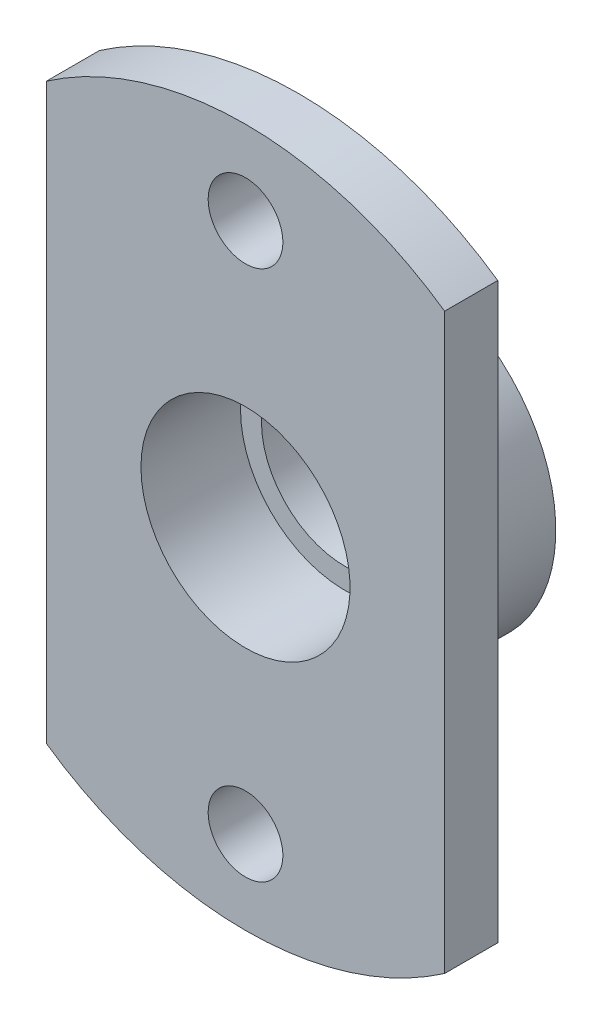
ISO-10303-21;
HEADER;
FILE_DESCRIPTION(('STEP AP214'),'2;1');
FILE_NAME('part.step','',(''),(''),'','','');
FILE_SCHEMA(('AUTOMOTIVE_DESIGN { 1 0 10303 214 1 1 1 1 }'));
ENDSEC;
DATA;
#1=APPLICATION_CONTEXT('core data for automotive mechanical design processes');
#2=APPLICATION_PROTOCOL_DEFINITION('international standard','automotive_design',2000,#1);
#3=PRODUCT_CONTEXT('',#1,'mechanical');
#4=PRODUCT('Part','Part','',(#3));
#5=PRODUCT_RELATED_PRODUCT_CATEGORY('part','',(#4));
#6=PRODUCT_DEFINITION_FORMATION('','',#4);
#7=PRODUCT_DEFINITION_CONTEXT('part definition',#1,'design');
#8=PRODUCT_DEFINITION('design','',#6,#7);
#9=PRODUCT_DEFINITION_SHAPE('','',#8);
#10=(LENGTH_UNIT() NAMED_UNIT(*) SI_UNIT(.MILLI.,.METRE.));
#11=(NAMED_UNIT(*) PLANE_ANGLE_UNIT() SI_UNIT($,.RADIAN.));
#12=(NAMED_UNIT(*) SI_UNIT($,.STERADIAN.) SOLID_ANGLE_UNIT());
#13=UNCERTAINTY_MEASURE_WITH_UNIT(LENGTH_MEASURE(1.E-05),#10,'distance_accuracy_value','');
#14=(GEOMETRIC_REPRESENTATION_CONTEXT(3) GLOBAL_UNCERTAINTY_ASSIGNED_CONTEXT((#13)) GLOBAL_UNIT_ASSIGNED_CONTEXT((#10,
#11,#12)) REPRESENTATION_CONTEXT('',''));
#15=CARTESIAN_POINT('',(0.,0.,0.));
#16=DIRECTION('',(0.,0.,1.));
#17=DIRECTION('',(1.,0.,0.));
#18=AXIS2_PLACEMENT_3D('',#15,#16,#17);
#19=CARTESIAN_POINT('',(-16.7,0.,-8.74451798495317));
#20=DIRECTION('',(0.,0.,-1.));
#21=DIRECTION('',(-1.,0.,0.));
#22=AXIS2_PLACEMENT_3D('',#19,#20,#21);
#23=CYLINDRICAL_SURFACE('',#22,16.7);
#24=CARTESIAN_POINT('',(-16.7,0.,0.));
#25=DIRECTION('',(0.,0.,-1.));
#26=DIRECTION('',(-1.,0.,0.));
#27=AXIS2_PLACEMENT_3D('',#24,#25,#26);
#28=CIRCLE('',#27,16.7);
#29=CARTESIAN_POINT('',(-7.175,-13.7173020306473,0.));
#30=VERTEX_POINT('',#29);
#31=CARTESIAN_POINT('',(-26.225,-13.7173020306473,0.));
#32=VERTEX_POINT('',#31);
#33=EDGE_CURVE('E89',#30,#32,#28,.T.);
#34=ORIENTED_EDGE('',*,*,#33,.T.);
#35=DIRECTION('',(0.,0.,-1.));
#36=VECTOR('',#35,1.);
#37=CARTESIAN_POINT('',(-26.225,-13.7173020306473,-8.74451798495316));
#38=LINE('',#37,#36);
#39=CARTESIAN_POINT('',(-26.225,-13.7173020306473,-2.53999999999999));
#40=VERTEX_POINT('',#39);
#41=EDGE_CURVE('E104',#32,#40,#38,.T.);
#42=ORIENTED_EDGE('',*,*,#41,.T.);
#43=CARTESIAN_POINT('',(-16.7,0.,-2.54));
#44=DIRECTION('',(0.,0.,-1.));
#45=DIRECTION('',(-1.,0.,0.));
#46=AXIS2_PLACEMENT_3D('',#43,#44,#45);
#47=CIRCLE('',#46,16.7);
#48=CARTESIAN_POINT('',(-7.175,-13.7173020306473,-2.54));
#49=VERTEX_POINT('',#48);
#50=EDGE_CURVE('E107',#49,#40,#47,.T.);
#51=ORIENTED_EDGE('',*,*,#50,.F.);
#52=DIRECTION('',(0.,0.,-1.));
#53=VECTOR('',#52,1.);
#54=CARTESIAN_POINT('',(-7.175,-13.7173020306473,-8.74451798495317));
#55=LINE('',#54,#53);
#56=EDGE_CURVE('E48',#49,#30,#55,.F.);
#57=ORIENTED_EDGE('',*,*,#56,.T.);
#58=EDGE_LOOP('',(#34,#42,#51,#57));
#59=FACE_BOUND('',#58,.T.);
#60=ADVANCED_FACE('F33',(#59),#23,.T.);
#61=CARTESIAN_POINT('',(-26.225,13.7173020306473,-2.53999999999999));
#62=VERTEX_POINT('',#61);
#63=CARTESIAN_POINT('',(-7.175,13.7173020306473,-2.54));
#64=VERTEX_POINT('',#63);
#65=EDGE_CURVE('E111',#62,#64,#47,.T.);
#66=ORIENTED_EDGE('',*,*,#65,.F.);
#67=DIRECTION('',(0.,0.,-1.));
#68=VECTOR('',#67,1.);
#69=CARTESIAN_POINT('',(-26.225,13.7173020306473,-8.74451798495316));
#70=LINE('',#69,#68);
#71=CARTESIAN_POINT('',(-26.225,13.7173020306473,0.));
#72=VERTEX_POINT('',#71);
#73=EDGE_CURVE('E56',#62,#72,#70,.F.);
#74=ORIENTED_EDGE('',*,*,#73,.T.);
#75=CARTESIAN_POINT('',(-7.175,13.7173020306473,0.));
#76=VERTEX_POINT('',#75);
#77=EDGE_CURVE('E87',#72,#76,#28,.T.);
#78=ORIENTED_EDGE('',*,*,#77,.T.);
#79=DIRECTION('',(0.,0.,-1.));
#80=VECTOR('',#79,1.);
#81=CARTESIAN_POINT('',(-7.175,13.7173020306473,-8.74451798495317));
#82=LINE('',#81,#80);
#83=EDGE_CURVE('E71',#76,#64,#82,.T.);
#84=ORIENTED_EDGE('',*,*,#83,.T.);
#85=EDGE_LOOP('',(#66,#74,#78,#84));
#86=FACE_BOUND('',#85,.T.);
#87=ADVANCED_FACE('F35',(#86),#23,.T.);
#88=CARTESIAN_POINT('',(0.,0.,0.));
#89=DIRECTION('',(0.,0.,-1.));
#90=DIRECTION('',(-1.,0.,0.));
#91=AXIS2_PLACEMENT_3D('',#88,#89,#90);
#92=PLANE('',#91);
#93=CARTESIAN_POINT('',(-16.7,12.7,0.));
#94=DIRECTION('',(0.,0.,-1.));
#95=DIRECTION('',(-1.,0.,0.));
#96=AXIS2_PLACEMENT_3D('',#93,#94,#95);
#97=CIRCLE('',#96,1.7859375);
#98=CARTESIAN_POINT('',(-18.4859375,12.7,0.));
#99=VERTEX_POINT('',#98);
#100=EDGE_CURVE('E153',#99,#99,#97,.F.);
#101=ORIENTED_EDGE('',*,*,#100,.F.);
#102=EDGE_LOOP('',(#101));
#103=FACE_BOUND('',#102,.T.);
#104=CARTESIAN_POINT('',(-16.7,-12.7,0.));
#105=DIRECTION('',(0.,0.,-1.));
#106=DIRECTION('',(-1.,0.,0.));
#107=AXIS2_PLACEMENT_3D('',#104,#105,#106);
#108=CIRCLE('',#107,1.78593749999999);
#109=CARTESIAN_POINT('',(-18.4859375,-12.7,0.));
#110=VERTEX_POINT('',#109);
#111=EDGE_CURVE('E91',#110,#110,#108,.F.);
#112=ORIENTED_EDGE('',*,*,#111,.F.);
#113=EDGE_LOOP('',(#112));
#114=FACE_BOUND('',#113,.T.);
#115=ORIENTED_EDGE('',*,*,#77,.F.);
#116=DIRECTION('',(0.,1.,0.));
#117=VECTOR('',#116,1.);
#118=CARTESIAN_POINT('',(-26.225,-15.875,0.));
#119=LINE('',#118,#117);
#120=EDGE_CURVE('E90',#32,#72,#119,.T.);
#121=ORIENTED_EDGE('',*,*,#120,.F.);
#122=ORIENTED_EDGE('',*,*,#33,.F.);
#123=DIRECTION('',(0.,-1.,0.));
#124=VECTOR('',#123,1.);
#125=CARTESIAN_POINT('',(-7.175,-15.875,0.));
#126=LINE('',#125,#124);
#127=EDGE_CURVE('E74',#76,#30,#126,.T.);
#128=ORIENTED_EDGE('',*,*,#127,.F.);
#129=EDGE_LOOP('',(#115,#121,#122,#128));
#130=FACE_BOUND('',#129,.T.);
#131=CARTESIAN_POINT('',(-16.7,0.,0.));
#132=DIRECTION('',(0.,0.,-1.));
#133=DIRECTION('',(-1.,0.,0.));
#134=AXIS2_PLACEMENT_3D('',#131,#132,#133);
#135=CIRCLE('',#134,5.);
#136=CARTESIAN_POINT('',(-21.7,0.,0.));
#137=VERTEX_POINT('',#136);
#138=EDGE_CURVE('E95',#137,#137,#135,.T.);
#139=ORIENTED_EDGE('',*,*,#138,.T.);
#140=EDGE_LOOP('',(#139));
#141=FACE_BOUND('',#140,.T.);
#142=ADVANCED_FACE('F84',(#103,#114,#130,#141),#92,.F.);
#143=CARTESIAN_POINT('',(-16.7,0.,-8.74451798495317));
#144=DIRECTION('',(0.,0.,-1.));
#145=DIRECTION('',(-1.,0.,0.));
#146=AXIS2_PLACEMENT_3D('',#143,#144,#145);
#147=CYLINDRICAL_SURFACE('',#146,5.);
#148=ORIENTED_EDGE('',*,*,#138,.F.);
#149=EDGE_LOOP('',(#148));
#150=FACE_BOUND('',#149,.T.);
#151=CARTESIAN_POINT('',(-16.7,0.,-4.7625));
#152=DIRECTION('',(0.,0.,-1.));
#153=DIRECTION('',(-1.,0.,0.));
#154=AXIS2_PLACEMENT_3D('',#151,#152,#153);
#155=CIRCLE('',#154,5.);
#156=CARTESIAN_POINT('',(-21.7,0.,-4.7625));
#157=VERTEX_POINT('',#156);
#158=EDGE_CURVE('E124',#157,#157,#155,.T.);
#159=ORIENTED_EDGE('',*,*,#158,.T.);
#160=EDGE_LOOP('',(#159));
#161=FACE_BOUND('',#160,.T.);
#162=ADVANCED_FACE('F131',(#150,#161),#147,.F.);
#163=CARTESIAN_POINT('',(-11.7,0.,-4.7625));
#164=DIRECTION('',(0.,0.,-1.));
#165=DIRECTION('',(-1.,0.,0.));
#166=AXIS2_PLACEMENT_3D('',#163,#164,#165);
#167=PLANE('',#166);
#168=ORIENTED_EDGE('',*,*,#158,.F.);
#169=EDGE_LOOP('',(#168));
#170=FACE_BOUND('',#169,.T.);
#171=CARTESIAN_POINT('',(-16.7,0.,-4.7625));
#172=DIRECTION('',(0.,0.,-1.));
#173=DIRECTION('',(-1.,0.,0.));
#174=AXIS2_PLACEMENT_3D('',#171,#172,#173);
#175=CIRCLE('',#174,4.);
#176=CARTESIAN_POINT('',(-20.7,0.,-4.7625));
#177=VERTEX_POINT('',#176);
#178=EDGE_CURVE('E122',#177,#177,#175,.T.);
#179=ORIENTED_EDGE('',*,*,#178,.T.);
#180=EDGE_LOOP('',(#179));
#181=FACE_BOUND('',#180,.T.);
#182=ADVANCED_FACE('F133',(#170,#181),#167,.F.);
#183=CARTESIAN_POINT('',(-16.7,0.,-8.74451798495317));
#184=DIRECTION('',(0.,0.,-1.));
#185=DIRECTION('',(-1.,0.,0.));
#186=AXIS2_PLACEMENT_3D('',#183,#184,#185);
#187=CYLINDRICAL_SURFACE('',#186,4.);
#188=ORIENTED_EDGE('',*,*,#178,.F.);
#189=EDGE_LOOP('',(#188));
#190=FACE_BOUND('',#189,.T.);
#191=CARTESIAN_POINT('',(-16.7,0.,-7.3025));
#192=DIRECTION('',(0.,0.,-1.));
#193=DIRECTION('',(-1.,0.,0.));
#194=AXIS2_PLACEMENT_3D('',#191,#192,#193);
#195=CIRCLE('',#194,4.);
#196=CARTESIAN_POINT('',(-20.7,0.,-7.3025));
#197=VERTEX_POINT('',#196);
#198=EDGE_CURVE('E119',#197,#197,#195,.T.);
#199=ORIENTED_EDGE('',*,*,#198,.T.);
#200=EDGE_LOOP('',(#199));
#201=FACE_BOUND('',#200,.T.);
#202=ADVANCED_FACE('F139',(#190,#201),#187,.F.);
#203=CARTESIAN_POINT('',(-12.7,0.,-7.3025));
#204=DIRECTION('',(0.,0.,1.));
#205=DIRECTION('',(1.,0.,0.));
#206=AXIS2_PLACEMENT_3D('',#203,#204,#205);
#207=PLANE('',#206);
#208=ORIENTED_EDGE('',*,*,#198,.F.);
#209=EDGE_LOOP('',(#208));
#210=FACE_BOUND('',#209,.T.);
#211=CARTESIAN_POINT('',(-16.7,0.,-7.3025));
#212=DIRECTION('',(0.,0.,-1.));
#213=DIRECTION('',(-1.,0.,0.));
#214=AXIS2_PLACEMENT_3D('',#211,#212,#213);
#215=CIRCLE('',#214,7.54);
#216=CARTESIAN_POINT('',(-24.24,0.,-7.3025));
#217=VERTEX_POINT('',#216);
#218=EDGE_CURVE('E116',#217,#217,#215,.T.);
#219=ORIENTED_EDGE('',*,*,#218,.T.);
#220=EDGE_LOOP('',(#219));
#221=FACE_BOUND('',#220,.T.);
#222=ADVANCED_FACE('F188',(#210,#221),#207,.F.);
#223=CARTESIAN_POINT('',(-16.7,0.,-8.74451798495317));
#224=DIRECTION('',(0.,0.,-1.));
#225=DIRECTION('',(-1.,0.,0.));
#226=AXIS2_PLACEMENT_3D('',#223,#224,#225);
#227=CYLINDRICAL_SURFACE('',#226,7.54);
#228=ORIENTED_EDGE('',*,*,#218,.F.);
#229=EDGE_LOOP('',(#228));
#230=FACE_BOUND('',#229,.T.);
#231=CARTESIAN_POINT('',(-16.7,0.,-2.54));
#232=DIRECTION('',(0.,0.,-1.));
#233=DIRECTION('',(-1.,0.,0.));
#234=AXIS2_PLACEMENT_3D('',#231,#232,#233);
#235=CIRCLE('',#234,7.54);
#236=CARTESIAN_POINT('',(-24.24,0.,-2.54));
#237=VERTEX_POINT('',#236);
#238=EDGE_CURVE('E113',#237,#237,#235,.T.);
#239=ORIENTED_EDGE('',*,*,#238,.T.);
#240=EDGE_LOOP('',(#239));
#241=FACE_BOUND('',#240,.T.);
#242=ADVANCED_FACE('F172',(#230,#241),#227,.T.);
#243=CARTESIAN_POINT('',(-9.16,0.,-2.54));
#244=DIRECTION('',(0.,0.,1.));
#245=DIRECTION('',(1.,0.,0.));
#246=AXIS2_PLACEMENT_3D('',#243,#244,#245);
#247=PLANE('',#246);
#248=CARTESIAN_POINT('',(-16.7,12.7,-2.54));
#249=DIRECTION('',(0.,0.,1.));
#250=DIRECTION('',(1.,0.,0.));
#251=AXIS2_PLACEMENT_3D('',#248,#249,#250);
#252=CIRCLE('',#251,1.7859375);
#253=CARTESIAN_POINT('',(-14.9140625,12.7,-2.54));
#254=VERTEX_POINT('',#253);
#255=EDGE_CURVE('E100',#254,#254,#252,.T.);
#256=ORIENTED_EDGE('',*,*,#255,.T.);
#257=EDGE_LOOP('',(#256));
#258=FACE_BOUND('',#257,.T.);
#259=CARTESIAN_POINT('',(-16.7,-12.7,-2.54));
#260=DIRECTION('',(0.,0.,1.));
#261=DIRECTION('',(1.,0.,0.));
#262=AXIS2_PLACEMENT_3D('',#259,#260,#261);
#263=CIRCLE('',#262,1.78593749999999);
#264=CARTESIAN_POINT('',(-14.9140625,-12.7,-2.54));
#265=VERTEX_POINT('',#264);
#266=EDGE_CURVE('E79',#265,#265,#263,.T.);
#267=ORIENTED_EDGE('',*,*,#266,.T.);
#268=EDGE_LOOP('',(#267));
#269=FACE_BOUND('',#268,.T.);
#270=ORIENTED_EDGE('',*,*,#238,.F.);
#271=EDGE_LOOP('',(#270));
#272=FACE_BOUND('',#271,.T.);
#273=ORIENTED_EDGE('',*,*,#50,.T.);
#274=DIRECTION('',(0.,1.,0.));
#275=VECTOR('',#274,1.);
#276=CARTESIAN_POINT('',(-26.225,0.,-2.53999999999999));
#277=LINE('',#276,#275);
#278=EDGE_CURVE('E11',#40,#62,#277,.T.);
#279=ORIENTED_EDGE('',*,*,#278,.T.);
#280=ORIENTED_EDGE('',*,*,#65,.T.);
#281=DIRECTION('',(0.,-1.,0.));
#282=VECTOR('',#281,1.);
#283=CARTESIAN_POINT('',(-7.175,0.,-2.54));
#284=LINE('',#283,#282);
#285=EDGE_CURVE('E41',#64,#49,#284,.T.);
#286=ORIENTED_EDGE('',*,*,#285,.T.);
#287=EDGE_LOOP('',(#273,#279,#280,#286));
#288=FACE_BOUND('',#287,.T.);
#289=ADVANCED_FACE('F169',(#258,#269,#272,#288),#247,.F.);
#290=CARTESIAN_POINT('',(-7.17499999999999,-15.875,40.6598389076986));
#291=DIRECTION('',(-1.,0.,0.));
#292=DIRECTION('',(0.,0.,1.));
#293=AXIS2_PLACEMENT_3D('',#290,#291,#292);
#294=PLANE('',#293);
#295=ORIENTED_EDGE('',*,*,#127,.T.);
#296=ORIENTED_EDGE('',*,*,#56,.F.);
#297=ORIENTED_EDGE('',*,*,#285,.F.);
#298=ORIENTED_EDGE('',*,*,#83,.F.);
#299=EDGE_LOOP('',(#295,#296,#297,#298));
#300=FACE_BOUND('',#299,.T.);
#301=ADVANCED_FACE('F73',(#300),#294,.F.);
#302=CARTESIAN_POINT('',(-16.7,-12.7,40.6598389076986));
#303=DIRECTION('',(0.,0.,-1.));
#304=DIRECTION('',(-1.,0.,0.));
#305=AXIS2_PLACEMENT_3D('',#302,#303,#304);
#306=CYLINDRICAL_SURFACE('',#305,1.78593749999999);
#307=ORIENTED_EDGE('',*,*,#111,.T.);
#308=EDGE_LOOP('',(#307));
#309=FACE_BOUND('',#308,.T.);
#310=ORIENTED_EDGE('',*,*,#266,.F.);
#311=EDGE_LOOP('',(#310));
#312=FACE_BOUND('',#311,.T.);
#313=ADVANCED_FACE('F163',(#309,#312),#306,.F.);
#314=CARTESIAN_POINT('',(-16.7,12.7,40.6598389076986));
#315=DIRECTION('',(0.,0.,-1.));
#316=DIRECTION('',(-1.,0.,0.));
#317=AXIS2_PLACEMENT_3D('',#314,#315,#316);
#318=CYLINDRICAL_SURFACE('',#317,1.7859375);
#319=ORIENTED_EDGE('',*,*,#100,.T.);
#320=EDGE_LOOP('',(#319));
#321=FACE_BOUND('',#320,.T.);
#322=ORIENTED_EDGE('',*,*,#255,.F.);
#323=EDGE_LOOP('',(#322));
#324=FACE_BOUND('',#323,.T.);
#325=ADVANCED_FACE('F158',(#321,#324),#318,.F.);
#326=CARTESIAN_POINT('',(-26.225,-15.875,40.6598389076986));
#327=DIRECTION('',(1.,0.,0.));
#328=DIRECTION('',(0.,0.,-1.));
#329=AXIS2_PLACEMENT_3D('',#326,#327,#328);
#330=PLANE('',#329);
#331=ORIENTED_EDGE('',*,*,#120,.T.);
#332=ORIENTED_EDGE('',*,*,#73,.F.);
#333=ORIENTED_EDGE('',*,*,#278,.F.);
#334=ORIENTED_EDGE('',*,*,#41,.F.);
#335=EDGE_LOOP('',(#331,#332,#333,#334));
#336=FACE_BOUND('',#335,.T.);
#337=ADVANCED_FACE('F176',(#336),#330,.F.);
#338=CLOSED_SHELL('',(#60,#87,#142,#162,#182,#202,#222,#242,#289,#301,#313,#325,#337));
#339=MANIFOLD_SOLID_BREP('B2',#338);
#340=ADVANCED_BREP_SHAPE_REPRESENTATION('',(#18,#339),#14);
#341=SHAPE_DEFINITION_REPRESENTATION(#9,#340);
ENDSEC;
END-ISO-10303-21;
